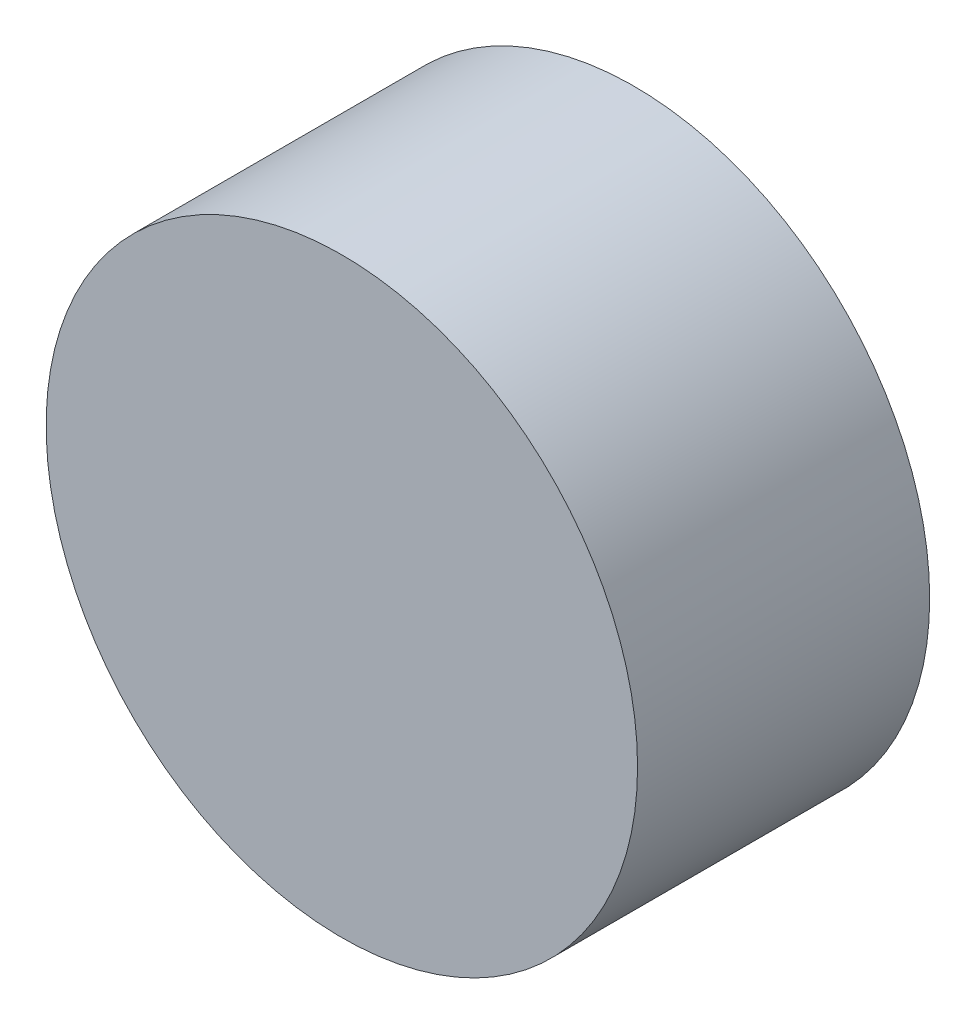
ISO-10303-21;
HEADER;
FILE_DESCRIPTION(('STEP AP214'),'2;1');
FILE_NAME('part.step','',(''),(''),'','','');
FILE_SCHEMA(('AUTOMOTIVE_DESIGN { 1 0 10303 214 1 1 1 1 }'));
ENDSEC;
DATA;
#1=APPLICATION_CONTEXT('core data for automotive mechanical design processes');
#2=APPLICATION_PROTOCOL_DEFINITION('international standard','automotive_design',2000,#1);
#3=PRODUCT_CONTEXT('',#1,'mechanical');
#4=PRODUCT('Part','Part','',(#3));
#5=PRODUCT_RELATED_PRODUCT_CATEGORY('part','',(#4));
#6=PRODUCT_DEFINITION_FORMATION('','',#4);
#7=PRODUCT_DEFINITION_CONTEXT('part definition',#1,'design');
#8=PRODUCT_DEFINITION('design','',#6,#7);
#9=PRODUCT_DEFINITION_SHAPE('','',#8);
#10=(LENGTH_UNIT() NAMED_UNIT(*) SI_UNIT(.MILLI.,.METRE.));
#11=(NAMED_UNIT(*) PLANE_ANGLE_UNIT() SI_UNIT($,.RADIAN.));
#12=(NAMED_UNIT(*) SI_UNIT($,.STERADIAN.) SOLID_ANGLE_UNIT());
#13=UNCERTAINTY_MEASURE_WITH_UNIT(LENGTH_MEASURE(1.E-05),#10,'distance_accuracy_value','');
#14=(GEOMETRIC_REPRESENTATION_CONTEXT(3) GLOBAL_UNCERTAINTY_ASSIGNED_CONTEXT((#13)) GLOBAL_UNIT_ASSIGNED_CONTEXT((#10,
#11,#12)) REPRESENTATION_CONTEXT('',''));
#15=CARTESIAN_POINT('',(0.,0.,0.));
#16=DIRECTION('',(0.,0.,1.));
#17=DIRECTION('',(1.,0.,0.));
#18=AXIS2_PLACEMENT_3D('',#15,#16,#17);
#19=CARTESIAN_POINT('',(0.,0.,10.));
#20=DIRECTION('',(0.,0.,-1.));
#21=DIRECTION('',(-1.,0.,0.));
#22=AXIS2_PLACEMENT_3D('',#19,#20,#21);
#23=CYLINDRICAL_SURFACE('',#22,10.1234567891235);
#24=CARTESIAN_POINT('',(0.,0.,10.));
#25=DIRECTION('',(0.,0.,1.));
#26=DIRECTION('',(1.,0.,0.));
#27=AXIS2_PLACEMENT_3D('',#24,#25,#26);
#28=CIRCLE('',#27,10.1234567891235);
#29=CARTESIAN_POINT('',(10.1234567891235,0.,10.));
#30=VERTEX_POINT('',#29);
#31=EDGE_CURVE('E10',#30,#30,#28,.T.);
#32=ORIENTED_EDGE('',*,*,#31,.F.);
#33=EDGE_LOOP('',(#32));
#34=FACE_BOUND('',#33,.T.);
#35=CARTESIAN_POINT('',(0.,0.,0.));
#36=DIRECTION('',(0.,0.,1.));
#37=DIRECTION('',(1.,0.,0.));
#38=AXIS2_PLACEMENT_3D('',#35,#36,#37);
#39=CIRCLE('',#38,10.1234567891235);
#40=CARTESIAN_POINT('',(10.1234567891235,0.,0.));
#41=VERTEX_POINT('',#40);
#42=EDGE_CURVE('E34',#41,#41,#39,.T.);
#43=ORIENTED_EDGE('',*,*,#42,.T.);
#44=EDGE_LOOP('',(#43));
#45=FACE_BOUND('',#44,.T.);
#46=ADVANCED_FACE('F31',(#34,#45),#23,.T.);
#47=CARTESIAN_POINT('',(0.,0.,10.));
#48=DIRECTION('',(0.,0.,1.));
#49=DIRECTION('',(1.,0.,0.));
#50=AXIS2_PLACEMENT_3D('',#47,#48,#49);
#51=PLANE('',#50);
#52=ORIENTED_EDGE('',*,*,#31,.T.);
#53=EDGE_LOOP('',(#52));
#54=FACE_BOUND('',#53,.T.);
#55=ADVANCED_FACE('F46',(#54),#51,.T.);
#56=CARTESIAN_POINT('',(0.,0.,0.));
#57=DIRECTION('',(0.,0.,1.));
#58=DIRECTION('',(1.,0.,0.));
#59=AXIS2_PLACEMENT_3D('',#56,#57,#58);
#60=PLANE('',#59);
#61=ORIENTED_EDGE('',*,*,#42,.F.);
#62=EDGE_LOOP('',(#61));
#63=FACE_BOUND('',#62,.T.);
#64=ADVANCED_FACE('F44',(#63),#60,.F.);
#65=CLOSED_SHELL('',(#46,#55,#64));
#66=MANIFOLD_SOLID_BREP('B2',#65);
#67=ADVANCED_BREP_SHAPE_REPRESENTATION('',(#18,#66),#14);
#68=SHAPE_DEFINITION_REPRESENTATION(#9,#67);
ENDSEC;
END-ISO-10303-21;
